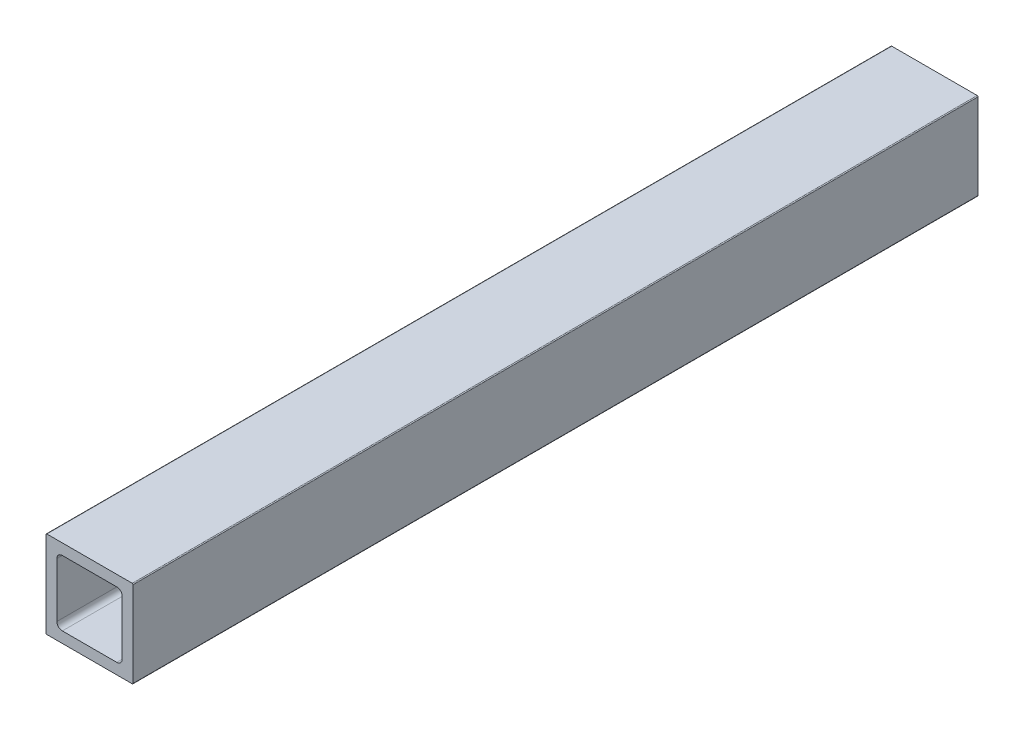
ISO-10303-21;
HEADER;
FILE_DESCRIPTION(('STEP AP214'),'2;1');
FILE_NAME('part.step','',(''),(''),'','','');
FILE_SCHEMA(('AUTOMOTIVE_DESIGN { 1 0 10303 214 1 1 1 1 }'));
ENDSEC;
DATA;
#1=APPLICATION_CONTEXT('core data for automotive mechanical design processes');
#2=APPLICATION_PROTOCOL_DEFINITION('international standard','automotive_design',2000,#1);
#3=PRODUCT_CONTEXT('',#1,'mechanical');
#4=PRODUCT('Part','Part','',(#3));
#5=PRODUCT_RELATED_PRODUCT_CATEGORY('part','',(#4));
#6=PRODUCT_DEFINITION_FORMATION('','',#4);
#7=PRODUCT_DEFINITION_CONTEXT('part definition',#1,'design');
#8=PRODUCT_DEFINITION('design','',#6,#7);
#9=PRODUCT_DEFINITION_SHAPE('','',#8);
#10=(LENGTH_UNIT() NAMED_UNIT(*) SI_UNIT(.MILLI.,.METRE.));
#11=(NAMED_UNIT(*) PLANE_ANGLE_UNIT() SI_UNIT($,.RADIAN.));
#12=(NAMED_UNIT(*) SI_UNIT($,.STERADIAN.) SOLID_ANGLE_UNIT());
#13=UNCERTAINTY_MEASURE_WITH_UNIT(LENGTH_MEASURE(1.E-05),#10,'distance_accuracy_value','');
#14=(GEOMETRIC_REPRESENTATION_CONTEXT(3) GLOBAL_UNCERTAINTY_ASSIGNED_CONTEXT((#13)) GLOBAL_UNIT_ASSIGNED_CONTEXT((#10,
#11,#12)) REPRESENTATION_CONTEXT('',''));
#15=CARTESIAN_POINT('',(0.,0.,0.));
#16=DIRECTION('',(0.,0.,1.));
#17=DIRECTION('',(1.,0.,0.));
#18=AXIS2_PLACEMENT_3D('',#15,#16,#17);
#19=CARTESIAN_POINT('',(0.254,0.254,0.));
#20=DIRECTION('',(0.,0.,-1.));
#21=DIRECTION('',(0.,-1.,0.));
#22=AXIS2_PLACEMENT_3D('',#19,#20,#21);
#23=PLANE('',#22);
#24=CARTESIAN_POINT('',(0.254,0.254,0.));
#25=DIRECTION('',(0.,0.,1.));
#26=DIRECTION('',(-1.,0.,0.));
#27=AXIS2_PLACEMENT_3D('',#24,#25,#26);
#28=CIRCLE('',#27,0.254);
#29=CARTESIAN_POINT('',(0.,0.254,0.));
#30=VERTEX_POINT('',#29);
#31=CARTESIAN_POINT('',(0.254,0.,0.));
#32=VERTEX_POINT('',#31);
#33=EDGE_CURVE('E193',#30,#32,#28,.T.);
#34=ORIENTED_EDGE('',*,*,#33,.F.);
#35=DIRECTION('',(0.,-1.,0.));
#36=VECTOR('',#35,1.);
#37=CARTESIAN_POINT('',(0.,0.254,0.));
#38=LINE('',#37,#36);
#39=CARTESIAN_POINT('',(0.,25.146,0.));
#40=VERTEX_POINT('',#39);
#41=EDGE_CURVE('E191',#40,#30,#38,.T.);
#42=ORIENTED_EDGE('',*,*,#41,.F.);
#43=CARTESIAN_POINT('',(0.254,25.146,0.));
#44=DIRECTION('',(0.,0.,1.));
#45=DIRECTION('',(-1.,0.,0.));
#46=AXIS2_PLACEMENT_3D('',#43,#44,#45);
#47=CIRCLE('',#46,0.254);
#48=CARTESIAN_POINT('',(0.254,25.4,0.));
#49=VERTEX_POINT('',#48);
#50=EDGE_CURVE('E213',#49,#40,#47,.T.);
#51=ORIENTED_EDGE('',*,*,#50,.F.);
#52=DIRECTION('',(-1.,0.,0.));
#53=VECTOR('',#52,1.);
#54=CARTESIAN_POINT('',(0.254,25.4,0.));
#55=LINE('',#54,#53);
#56=CARTESIAN_POINT('',(25.146,25.4,0.));
#57=VERTEX_POINT('',#56);
#58=EDGE_CURVE('E204',#57,#49,#55,.T.);
#59=ORIENTED_EDGE('',*,*,#58,.F.);
#60=CARTESIAN_POINT('',(25.146,25.146,0.));
#61=DIRECTION('',(0.,0.,1.));
#62=DIRECTION('',(-1.,0.,0.));
#63=AXIS2_PLACEMENT_3D('',#60,#61,#62);
#64=CIRCLE('',#63,0.254);
#65=CARTESIAN_POINT('',(25.4,25.146,0.));
#66=VERTEX_POINT('',#65);
#67=EDGE_CURVE('E236',#66,#57,#64,.T.);
#68=ORIENTED_EDGE('',*,*,#67,.F.);
#69=DIRECTION('',(0.,1.,0.));
#70=VECTOR('',#69,1.);
#71=CARTESIAN_POINT('',(25.4,0.254,0.));
#72=LINE('',#71,#70);
#73=CARTESIAN_POINT('',(25.4,0.254,0.));
#74=VERTEX_POINT('',#73);
#75=EDGE_CURVE('E235',#74,#66,#72,.T.);
#76=ORIENTED_EDGE('',*,*,#75,.F.);
#77=CARTESIAN_POINT('',(25.146,0.254,0.));
#78=DIRECTION('',(0.,0.,1.));
#79=DIRECTION('',(1.,0.,0.));
#80=AXIS2_PLACEMENT_3D('',#77,#78,#79);
#81=CIRCLE('',#80,0.254);
#82=CARTESIAN_POINT('',(25.146,0.,0.));
#83=VERTEX_POINT('',#82);
#84=EDGE_CURVE('E206',#83,#74,#81,.T.);
#85=ORIENTED_EDGE('',*,*,#84,.F.);
#86=DIRECTION('',(1.,0.,0.));
#87=VECTOR('',#86,1.);
#88=CARTESIAN_POINT('',(0.254,0.,0.));
#89=LINE('',#88,#87);
#90=EDGE_CURVE('E194',#32,#83,#89,.T.);
#91=ORIENTED_EDGE('',*,*,#90,.F.);
#92=EDGE_LOOP('',(#34,#42,#51,#59,#68,#76,#85,#91));
#93=FACE_BOUND('',#92,.T.);
#94=DIRECTION('',(0.,-1.,0.));
#95=VECTOR('',#94,1.);
#96=CARTESIAN_POINT('',(3.175,4.7625,0.));
#97=LINE('',#96,#95);
#98=CARTESIAN_POINT('',(3.175,20.6375,0.));
#99=VERTEX_POINT('',#98);
#100=CARTESIAN_POINT('',(3.175,4.7625,0.));
#101=VERTEX_POINT('',#100);
#102=EDGE_CURVE('E52',#99,#101,#97,.T.);
#103=ORIENTED_EDGE('',*,*,#102,.T.);
#104=CARTESIAN_POINT('',(4.7625,4.7625,0.));
#105=DIRECTION('',(0.,0.,1.));
#106=DIRECTION('',(1.,0.,0.));
#107=AXIS2_PLACEMENT_3D('',#104,#105,#106);
#108=CIRCLE('',#107,1.5875);
#109=CARTESIAN_POINT('',(4.7625,3.175,0.));
#110=VERTEX_POINT('',#109);
#111=EDGE_CURVE('E266',#101,#110,#108,.T.);
#112=ORIENTED_EDGE('',*,*,#111,.T.);
#113=DIRECTION('',(1.,0.,0.));
#114=VECTOR('',#113,1.);
#115=CARTESIAN_POINT('',(4.7625,3.175,0.));
#116=LINE('',#115,#114);
#117=CARTESIAN_POINT('',(20.6375,3.175,0.));
#118=VERTEX_POINT('',#117);
#119=EDGE_CURVE('E250',#110,#118,#116,.T.);
#120=ORIENTED_EDGE('',*,*,#119,.T.);
#121=CARTESIAN_POINT('',(20.6375,4.7625,0.));
#122=DIRECTION('',(0.,0.,1.));
#123=DIRECTION('',(-1.,0.,0.));
#124=AXIS2_PLACEMENT_3D('',#121,#122,#123);
#125=CIRCLE('',#124,1.5875);
#126=CARTESIAN_POINT('',(22.225,4.7625,0.));
#127=VERTEX_POINT('',#126);
#128=EDGE_CURVE('E223',#118,#127,#125,.T.);
#129=ORIENTED_EDGE('',*,*,#128,.T.);
#130=DIRECTION('',(0.,1.,0.));
#131=VECTOR('',#130,1.);
#132=CARTESIAN_POINT('',(22.225,4.7625,0.));
#133=LINE('',#132,#131);
#134=CARTESIAN_POINT('',(22.225,20.6375,0.));
#135=VERTEX_POINT('',#134);
#136=EDGE_CURVE('E219',#127,#135,#133,.T.);
#137=ORIENTED_EDGE('',*,*,#136,.T.);
#138=CARTESIAN_POINT('',(20.6375,20.6375,0.));
#139=DIRECTION('',(0.,0.,1.));
#140=DIRECTION('',(-1.,0.,0.));
#141=AXIS2_PLACEMENT_3D('',#138,#139,#140);
#142=CIRCLE('',#141,1.5875);
#143=CARTESIAN_POINT('',(20.6375,22.225,0.));
#144=VERTEX_POINT('',#143);
#145=EDGE_CURVE('E224',#135,#144,#142,.T.);
#146=ORIENTED_EDGE('',*,*,#145,.T.);
#147=DIRECTION('',(-1.,0.,0.));
#148=VECTOR('',#147,1.);
#149=CARTESIAN_POINT('',(4.7625,22.225,0.));
#150=LINE('',#149,#148);
#151=CARTESIAN_POINT('',(4.7625,22.225,0.));
#152=VERTEX_POINT('',#151);
#153=EDGE_CURVE('E229',#144,#152,#150,.T.);
#154=ORIENTED_EDGE('',*,*,#153,.T.);
#155=CARTESIAN_POINT('',(4.7625,20.6375,0.));
#156=DIRECTION('',(0.,0.,1.));
#157=DIRECTION('',(-1.,0.,0.));
#158=AXIS2_PLACEMENT_3D('',#155,#156,#157);
#159=CIRCLE('',#158,1.5875);
#160=EDGE_CURVE('E197',#152,#99,#159,.T.);
#161=ORIENTED_EDGE('',*,*,#160,.T.);
#162=EDGE_LOOP('',(#103,#112,#120,#129,#137,#146,#154,#161));
#163=FACE_BOUND('',#162,.T.);
#164=ADVANCED_FACE('F44',(#93,#163),#23,.T.);
#165=CARTESIAN_POINT('',(0.254,0.254,1828.8));
#166=DIRECTION('',(0.,0.,-1.));
#167=DIRECTION('',(-1.,0.,0.));
#168=AXIS2_PLACEMENT_3D('',#165,#166,#167);
#169=CYLINDRICAL_SURFACE('',#168,0.254);
#170=CARTESIAN_POINT('',(0.254,0.254,246.38));
#171=DIRECTION('',(0.,0.,-1.));
#172=DIRECTION('',(-1.,0.,0.));
#173=AXIS2_PLACEMENT_3D('',#170,#171,#172);
#174=CIRCLE('',#173,0.254);
#175=CARTESIAN_POINT('',(0.,0.254,246.38));
#176=VERTEX_POINT('',#175);
#177=CARTESIAN_POINT('',(0.254,0.,246.38));
#178=VERTEX_POINT('',#177);
#179=EDGE_CURVE('E172',#176,#178,#174,.F.);
#180=ORIENTED_EDGE('',*,*,#179,.F.);
#181=DIRECTION('',(0.,0.,-1.));
#182=VECTOR('',#181,1.);
#183=CARTESIAN_POINT('',(0.,0.254,1828.8));
#184=LINE('',#183,#182);
#185=EDGE_CURVE('E183',#176,#30,#184,.T.);
#186=ORIENTED_EDGE('',*,*,#185,.T.);
#187=ORIENTED_EDGE('',*,*,#33,.T.);
#188=DIRECTION('',(0.,0.,-1.));
#189=VECTOR('',#188,1.);
#190=CARTESIAN_POINT('',(0.254,0.,1828.8));
#191=LINE('',#190,#189);
#192=EDGE_CURVE('E185',#178,#32,#191,.T.);
#193=ORIENTED_EDGE('',*,*,#192,.F.);
#194=EDGE_LOOP('',(#180,#186,#187,#193));
#195=FACE_BOUND('',#194,.T.);
#196=ADVANCED_FACE('F181',(#195),#169,.T.);
#197=CARTESIAN_POINT('',(0.254,0.,1828.8));
#198=DIRECTION('',(0.,1.,0.));
#199=DIRECTION('',(1.,0.,0.));
#200=AXIS2_PLACEMENT_3D('',#197,#198,#199);
#201=PLANE('',#200);
#202=DIRECTION('',(0.,0.,-1.));
#203=VECTOR('',#202,1.);
#204=CARTESIAN_POINT('',(25.146,0.,1828.8));
#205=LINE('',#204,#203);
#206=CARTESIAN_POINT('',(25.146,0.,246.38));
#207=VERTEX_POINT('',#206);
#208=EDGE_CURVE('E210',#207,#83,#205,.T.);
#209=ORIENTED_EDGE('',*,*,#208,.F.);
#210=DIRECTION('',(1.,0.,0.));
#211=VECTOR('',#210,1.);
#212=CARTESIAN_POINT('',(0.,0.,246.38));
#213=LINE('',#212,#211);
#214=EDGE_CURVE('E177',#178,#207,#213,.T.);
#215=ORIENTED_EDGE('',*,*,#214,.F.);
#216=ORIENTED_EDGE('',*,*,#192,.T.);
#217=ORIENTED_EDGE('',*,*,#90,.T.);
#218=EDGE_LOOP('',(#209,#215,#216,#217));
#219=FACE_BOUND('',#218,.T.);
#220=ADVANCED_FACE('F289',(#219),#201,.F.);
#221=CARTESIAN_POINT('',(25.146,0.254,1828.8));
#222=DIRECTION('',(0.,0.,-1.));
#223=DIRECTION('',(-1.,0.,0.));
#224=AXIS2_PLACEMENT_3D('',#221,#222,#223);
#225=CYLINDRICAL_SURFACE('',#224,0.254);
#226=CARTESIAN_POINT('',(25.146,0.254,246.38));
#227=DIRECTION('',(0.,0.,-1.));
#228=DIRECTION('',(-1.,0.,0.));
#229=AXIS2_PLACEMENT_3D('',#226,#227,#228);
#230=CIRCLE('',#229,0.254);
#231=CARTESIAN_POINT('',(25.4,0.254,246.38));
#232=VERTEX_POINT('',#231);
#233=EDGE_CURVE('E187',#207,#232,#230,.F.);
#234=ORIENTED_EDGE('',*,*,#233,.F.);
#235=ORIENTED_EDGE('',*,*,#208,.T.);
#236=ORIENTED_EDGE('',*,*,#84,.T.);
#237=DIRECTION('',(0.,0.,-1.));
#238=VECTOR('',#237,1.);
#239=CARTESIAN_POINT('',(25.4,0.254,1828.8));
#240=LINE('',#239,#238);
#241=EDGE_CURVE('E233',#232,#74,#240,.T.);
#242=ORIENTED_EDGE('',*,*,#241,.F.);
#243=EDGE_LOOP('',(#234,#235,#236,#242));
#244=FACE_BOUND('',#243,.T.);
#245=ADVANCED_FACE('F283',(#244),#225,.T.);
#246=CARTESIAN_POINT('',(25.4,0.254,1828.8));
#247=DIRECTION('',(-1.,0.,0.));
#248=DIRECTION('',(0.,0.,1.));
#249=AXIS2_PLACEMENT_3D('',#246,#247,#248);
#250=PLANE('',#249);
#251=DIRECTION('',(0.,0.,-1.));
#252=VECTOR('',#251,1.);
#253=CARTESIAN_POINT('',(25.4,25.146,1828.8));
#254=LINE('',#253,#252);
#255=CARTESIAN_POINT('',(25.4,25.146,246.38));
#256=VERTEX_POINT('',#255);
#257=EDGE_CURVE('E258',#256,#66,#254,.T.);
#258=ORIENTED_EDGE('',*,*,#257,.F.);
#259=DIRECTION('',(0.,1.,0.));
#260=VECTOR('',#259,1.);
#261=CARTESIAN_POINT('',(25.4,0.,246.38));
#262=LINE('',#261,#260);
#263=EDGE_CURVE('E498',#232,#256,#262,.T.);
#264=ORIENTED_EDGE('',*,*,#263,.F.);
#265=ORIENTED_EDGE('',*,*,#241,.T.);
#266=ORIENTED_EDGE('',*,*,#75,.T.);
#267=EDGE_LOOP('',(#258,#264,#265,#266));
#268=FACE_BOUND('',#267,.T.);
#269=ADVANCED_FACE('F288',(#268),#250,.F.);
#270=CARTESIAN_POINT('',(25.146,25.146,1828.8));
#271=DIRECTION('',(0.,0.,-1.));
#272=DIRECTION('',(-1.,0.,0.));
#273=AXIS2_PLACEMENT_3D('',#270,#271,#272);
#274=CYLINDRICAL_SURFACE('',#273,0.254);
#275=CARTESIAN_POINT('',(25.146,25.146,246.38));
#276=DIRECTION('',(0.,0.,-1.));
#277=DIRECTION('',(-1.,0.,0.));
#278=AXIS2_PLACEMENT_3D('',#275,#276,#277);
#279=CIRCLE('',#278,0.254);
#280=CARTESIAN_POINT('',(25.146,25.4,246.38));
#281=VERTEX_POINT('',#280);
#282=EDGE_CURVE('E492',#256,#281,#279,.F.);
#283=ORIENTED_EDGE('',*,*,#282,.F.);
#284=ORIENTED_EDGE('',*,*,#257,.T.);
#285=ORIENTED_EDGE('',*,*,#67,.T.);
#286=DIRECTION('',(0.,0.,-1.));
#287=VECTOR('',#286,1.);
#288=CARTESIAN_POINT('',(25.146,25.4,1828.8));
#289=LINE('',#288,#287);
#290=EDGE_CURVE('E227',#281,#57,#289,.T.);
#291=ORIENTED_EDGE('',*,*,#290,.F.);
#292=EDGE_LOOP('',(#283,#284,#285,#291));
#293=FACE_BOUND('',#292,.T.);
#294=ADVANCED_FACE('F46',(#293),#274,.T.);
#295=CARTESIAN_POINT('',(0.254,25.4,1828.8));
#296=DIRECTION('',(0.,-1.,0.));
#297=DIRECTION('',(0.,0.,-1.));
#298=AXIS2_PLACEMENT_3D('',#295,#296,#297);
#299=PLANE('',#298);
#300=DIRECTION('',(0.,0.,-1.));
#301=VECTOR('',#300,1.);
#302=CARTESIAN_POINT('',(0.254,25.4,1828.8));
#303=LINE('',#302,#301);
#304=CARTESIAN_POINT('',(0.254,25.4,246.38));
#305=VERTEX_POINT('',#304);
#306=EDGE_CURVE('E211',#305,#49,#303,.T.);
#307=ORIENTED_EDGE('',*,*,#306,.F.);
#308=DIRECTION('',(-1.,0.,0.));
#309=VECTOR('',#308,1.);
#310=CARTESIAN_POINT('',(0.,25.4,246.38));
#311=LINE('',#310,#309);
#312=EDGE_CURVE('E545',#281,#305,#311,.T.);
#313=ORIENTED_EDGE('',*,*,#312,.F.);
#314=ORIENTED_EDGE('',*,*,#290,.T.);
#315=ORIENTED_EDGE('',*,*,#58,.T.);
#316=EDGE_LOOP('',(#307,#313,#314,#315));
#317=FACE_BOUND('',#316,.T.);
#318=ADVANCED_FACE('F347',(#317),#299,.F.);
#319=CARTESIAN_POINT('',(0.254,25.146,1828.8));
#320=DIRECTION('',(0.,0.,-1.));
#321=DIRECTION('',(-1.,0.,0.));
#322=AXIS2_PLACEMENT_3D('',#319,#320,#321);
#323=CYLINDRICAL_SURFACE('',#322,0.254);
#324=CARTESIAN_POINT('',(0.254,25.146,246.38));
#325=DIRECTION('',(0.,0.,-1.));
#326=DIRECTION('',(-1.,0.,0.));
#327=AXIS2_PLACEMENT_3D('',#324,#325,#326);
#328=CIRCLE('',#327,0.254);
#329=CARTESIAN_POINT('',(0.,25.146,246.38));
#330=VERTEX_POINT('',#329);
#331=EDGE_CURVE('E59',#305,#330,#328,.F.);
#332=ORIENTED_EDGE('',*,*,#331,.F.);
#333=ORIENTED_EDGE('',*,*,#306,.T.);
#334=ORIENTED_EDGE('',*,*,#50,.T.);
#335=DIRECTION('',(0.,0.,-1.));
#336=VECTOR('',#335,1.);
#337=CARTESIAN_POINT('',(0.,25.146,1828.8));
#338=LINE('',#337,#336);
#339=EDGE_CURVE('E216',#330,#40,#338,.T.);
#340=ORIENTED_EDGE('',*,*,#339,.F.);
#341=EDGE_LOOP('',(#332,#333,#334,#340));
#342=FACE_BOUND('',#341,.T.);
#343=ADVANCED_FACE('F276',(#342),#323,.T.);
#344=CARTESIAN_POINT('',(0.,0.254,1828.8));
#345=DIRECTION('',(1.,0.,0.));
#346=DIRECTION('',(0.,1.,0.));
#347=AXIS2_PLACEMENT_3D('',#344,#345,#346);
#348=PLANE('',#347);
#349=ORIENTED_EDGE('',*,*,#185,.F.);
#350=DIRECTION('',(0.,-1.,0.));
#351=VECTOR('',#350,1.);
#352=CARTESIAN_POINT('',(0.,0.,246.38));
#353=LINE('',#352,#351);
#354=EDGE_CURVE('E169',#330,#176,#353,.T.);
#355=ORIENTED_EDGE('',*,*,#354,.F.);
#356=ORIENTED_EDGE('',*,*,#339,.T.);
#357=ORIENTED_EDGE('',*,*,#41,.T.);
#358=EDGE_LOOP('',(#349,#355,#356,#357));
#359=FACE_BOUND('',#358,.T.);
#360=ADVANCED_FACE('F189',(#359),#348,.F.);
#361=CARTESIAN_POINT('',(4.7625,4.7625,1828.8));
#362=DIRECTION('',(0.,0.,-1.));
#363=DIRECTION('',(-1.,0.,0.));
#364=AXIS2_PLACEMENT_3D('',#361,#362,#363);
#365=CYLINDRICAL_SURFACE('',#364,1.5875);
#366=DIRECTION('',(0.,0.,-1.));
#367=VECTOR('',#366,1.);
#368=CARTESIAN_POINT('',(3.175,4.7625,1828.8));
#369=LINE('',#368,#367);
#370=CARTESIAN_POINT('',(3.175,4.7625,246.38));
#371=VERTEX_POINT('',#370);
#372=EDGE_CURVE('E186',#371,#101,#369,.T.);
#373=ORIENTED_EDGE('',*,*,#372,.F.);
#374=CARTESIAN_POINT('',(4.7625,4.7625,246.38));
#375=DIRECTION('',(0.,0.,-1.));
#376=DIRECTION('',(-1.,0.,0.));
#377=AXIS2_PLACEMENT_3D('',#374,#375,#376);
#378=CIRCLE('',#377,1.5875);
#379=CARTESIAN_POINT('',(4.7625,3.175,246.38));
#380=VERTEX_POINT('',#379);
#381=EDGE_CURVE('E66',#371,#380,#378,.F.);
#382=ORIENTED_EDGE('',*,*,#381,.T.);
#383=DIRECTION('',(0.,0.,-1.));
#384=VECTOR('',#383,1.);
#385=CARTESIAN_POINT('',(4.7625,3.175,1828.8));
#386=LINE('',#385,#384);
#387=EDGE_CURVE('E214',#380,#110,#386,.T.);
#388=ORIENTED_EDGE('',*,*,#387,.T.);
#389=ORIENTED_EDGE('',*,*,#111,.F.);
#390=EDGE_LOOP('',(#373,#382,#388,#389));
#391=FACE_BOUND('',#390,.T.);
#392=ADVANCED_FACE('F275',(#391),#365,.F.);
#393=CARTESIAN_POINT('',(4.7625,3.175,1828.8));
#394=DIRECTION('',(0.,1.,0.));
#395=DIRECTION('',(1.,0.,0.));
#396=AXIS2_PLACEMENT_3D('',#393,#394,#395);
#397=PLANE('',#396);
#398=DIRECTION('',(-1.,0.,0.));
#399=VECTOR('',#398,1.);
#400=CARTESIAN_POINT('',(4.7625,3.175,246.38));
#401=LINE('',#400,#399);
#402=CARTESIAN_POINT('',(20.6375,3.175,246.38));
#403=VERTEX_POINT('',#402);
#404=EDGE_CURVE('E532',#403,#380,#401,.T.);
#405=ORIENTED_EDGE('',*,*,#404,.F.);
#406=DIRECTION('',(0.,0.,-1.));
#407=VECTOR('',#406,1.);
#408=CARTESIAN_POINT('',(20.6375,3.175,1828.8));
#409=LINE('',#408,#407);
#410=EDGE_CURVE('E217',#403,#118,#409,.T.);
#411=ORIENTED_EDGE('',*,*,#410,.T.);
#412=ORIENTED_EDGE('',*,*,#119,.F.);
#413=ORIENTED_EDGE('',*,*,#387,.F.);
#414=EDGE_LOOP('',(#405,#411,#412,#413));
#415=FACE_BOUND('',#414,.T.);
#416=ADVANCED_FACE('F302',(#415),#397,.T.);
#417=CARTESIAN_POINT('',(20.6375,4.7625,1828.8));
#418=DIRECTION('',(0.,0.,-1.));
#419=DIRECTION('',(-1.,0.,0.));
#420=AXIS2_PLACEMENT_3D('',#417,#418,#419);
#421=CYLINDRICAL_SURFACE('',#420,1.5875);
#422=ORIENTED_EDGE('',*,*,#410,.F.);
#423=CARTESIAN_POINT('',(20.6375,4.7625,246.38));
#424=DIRECTION('',(0.,0.,-1.));
#425=DIRECTION('',(-1.,0.,0.));
#426=AXIS2_PLACEMENT_3D('',#423,#424,#425);
#427=CIRCLE('',#426,1.5875);
#428=CARTESIAN_POINT('',(22.225,4.7625,246.38));
#429=VERTEX_POINT('',#428);
#430=EDGE_CURVE('E513',#403,#429,#427,.F.);
#431=ORIENTED_EDGE('',*,*,#430,.T.);
#432=DIRECTION('',(0.,0.,-1.));
#433=VECTOR('',#432,1.);
#434=CARTESIAN_POINT('',(22.225,4.7625,1828.8));
#435=LINE('',#434,#433);
#436=EDGE_CURVE('E254',#429,#127,#435,.T.);
#437=ORIENTED_EDGE('',*,*,#436,.T.);
#438=ORIENTED_EDGE('',*,*,#128,.F.);
#439=EDGE_LOOP('',(#422,#431,#437,#438));
#440=FACE_BOUND('',#439,.T.);
#441=ADVANCED_FACE('F297',(#440),#421,.F.);
#442=CARTESIAN_POINT('',(22.225,4.7625,1828.8));
#443=DIRECTION('',(-1.,0.,0.));
#444=DIRECTION('',(0.,0.,1.));
#445=AXIS2_PLACEMENT_3D('',#442,#443,#444);
#446=PLANE('',#445);
#447=DIRECTION('',(0.,-1.,0.));
#448=VECTOR('',#447,1.);
#449=CARTESIAN_POINT('',(22.225,4.7625,246.38));
#450=LINE('',#449,#448);
#451=CARTESIAN_POINT('',(22.225,20.6375,246.38));
#452=VERTEX_POINT('',#451);
#453=EDGE_CURVE('E535',#452,#429,#450,.T.);
#454=ORIENTED_EDGE('',*,*,#453,.F.);
#455=DIRECTION('',(0.,0.,-1.));
#456=VECTOR('',#455,1.);
#457=CARTESIAN_POINT('',(22.225,20.6375,1828.8));
#458=LINE('',#457,#456);
#459=EDGE_CURVE('E240',#452,#135,#458,.T.);
#460=ORIENTED_EDGE('',*,*,#459,.T.);
#461=ORIENTED_EDGE('',*,*,#136,.F.);
#462=ORIENTED_EDGE('',*,*,#436,.F.);
#463=EDGE_LOOP('',(#454,#460,#461,#462));
#464=FACE_BOUND('',#463,.T.);
#465=ADVANCED_FACE('F301',(#464),#446,.T.);
#466=CARTESIAN_POINT('',(20.6375,20.6375,1828.8));
#467=DIRECTION('',(0.,0.,-1.));
#468=DIRECTION('',(-1.,0.,0.));
#469=AXIS2_PLACEMENT_3D('',#466,#467,#468);
#470=CYLINDRICAL_SURFACE('',#469,1.5875);
#471=ORIENTED_EDGE('',*,*,#459,.F.);
#472=CARTESIAN_POINT('',(20.6375,20.6375,246.38));
#473=DIRECTION('',(0.,0.,-1.));
#474=DIRECTION('',(-1.,0.,0.));
#475=AXIS2_PLACEMENT_3D('',#472,#473,#474);
#476=CIRCLE('',#475,1.5875);
#477=CARTESIAN_POINT('',(20.6375,22.225,246.38));
#478=VERTEX_POINT('',#477);
#479=EDGE_CURVE('E537',#452,#478,#476,.F.);
#480=ORIENTED_EDGE('',*,*,#479,.T.);
#481=DIRECTION('',(0.,0.,-1.));
#482=VECTOR('',#481,1.);
#483=CARTESIAN_POINT('',(20.6375,22.225,1828.8));
#484=LINE('',#483,#482);
#485=EDGE_CURVE('E238',#478,#144,#484,.T.);
#486=ORIENTED_EDGE('',*,*,#485,.T.);
#487=ORIENTED_EDGE('',*,*,#145,.F.);
#488=EDGE_LOOP('',(#471,#480,#486,#487));
#489=FACE_BOUND('',#488,.T.);
#490=ADVANCED_FACE('F309',(#489),#470,.F.);
#491=CARTESIAN_POINT('',(4.7625,22.225,1828.8));
#492=DIRECTION('',(0.,-1.,0.));
#493=DIRECTION('',(0.,0.,-1.));
#494=AXIS2_PLACEMENT_3D('',#491,#492,#493);
#495=PLANE('',#494);
#496=DIRECTION('',(1.,0.,0.));
#497=VECTOR('',#496,1.);
#498=CARTESIAN_POINT('',(4.7625,22.225,246.38));
#499=LINE('',#498,#497);
#500=CARTESIAN_POINT('',(4.7625,22.225,246.38));
#501=VERTEX_POINT('',#500);
#502=EDGE_CURVE('E540',#501,#478,#499,.T.);
#503=ORIENTED_EDGE('',*,*,#502,.F.);
#504=DIRECTION('',(0.,0.,-1.));
#505=VECTOR('',#504,1.);
#506=CARTESIAN_POINT('',(4.7625,22.225,1828.8));
#507=LINE('',#506,#505);
#508=EDGE_CURVE('E241',#501,#152,#507,.T.);
#509=ORIENTED_EDGE('',*,*,#508,.T.);
#510=ORIENTED_EDGE('',*,*,#153,.F.);
#511=ORIENTED_EDGE('',*,*,#485,.F.);
#512=EDGE_LOOP('',(#503,#509,#510,#511));
#513=FACE_BOUND('',#512,.T.);
#514=ADVANCED_FACE('F313',(#513),#495,.T.);
#515=CARTESIAN_POINT('',(4.7625,20.6375,1828.8));
#516=DIRECTION('',(0.,0.,-1.));
#517=DIRECTION('',(-1.,0.,0.));
#518=AXIS2_PLACEMENT_3D('',#515,#516,#517);
#519=CYLINDRICAL_SURFACE('',#518,1.5875);
#520=ORIENTED_EDGE('',*,*,#508,.F.);
#521=CARTESIAN_POINT('',(4.7625,20.6375,246.38));
#522=DIRECTION('',(0.,0.,-1.));
#523=DIRECTION('',(-1.,0.,0.));
#524=AXIS2_PLACEMENT_3D('',#521,#522,#523);
#525=CIRCLE('',#524,1.5875);
#526=CARTESIAN_POINT('',(3.175,20.6375,246.38));
#527=VERTEX_POINT('',#526);
#528=EDGE_CURVE('E542',#501,#527,#525,.F.);
#529=ORIENTED_EDGE('',*,*,#528,.T.);
#530=DIRECTION('',(0.,0.,-1.));
#531=VECTOR('',#530,1.);
#532=CARTESIAN_POINT('',(3.175,20.6375,1828.8));
#533=LINE('',#532,#531);
#534=EDGE_CURVE('E245',#527,#99,#533,.T.);
#535=ORIENTED_EDGE('',*,*,#534,.T.);
#536=ORIENTED_EDGE('',*,*,#160,.F.);
#537=EDGE_LOOP('',(#520,#529,#535,#536));
#538=FACE_BOUND('',#537,.T.);
#539=ADVANCED_FACE('F390',(#538),#519,.F.);
#540=CARTESIAN_POINT('',(3.175,4.7625,1828.8));
#541=DIRECTION('',(1.,0.,0.));
#542=DIRECTION('',(0.,1.,0.));
#543=AXIS2_PLACEMENT_3D('',#540,#541,#542);
#544=PLANE('',#543);
#545=DIRECTION('',(0.,1.,0.));
#546=VECTOR('',#545,1.);
#547=CARTESIAN_POINT('',(3.175,4.7625,246.38));
#548=LINE('',#547,#546);
#549=EDGE_CURVE('E11',#371,#527,#548,.T.);
#550=ORIENTED_EDGE('',*,*,#549,.F.);
#551=ORIENTED_EDGE('',*,*,#372,.T.);
#552=ORIENTED_EDGE('',*,*,#102,.F.);
#553=ORIENTED_EDGE('',*,*,#534,.F.);
#554=EDGE_LOOP('',(#550,#551,#552,#553));
#555=FACE_BOUND('',#554,.T.);
#556=ADVANCED_FACE('F394',(#555),#544,.T.);
#557=CARTESIAN_POINT('',(0.,0.,246.38));
#558=DIRECTION('',(0.,0.,-1.));
#559=DIRECTION('',(-1.,0.,0.));
#560=AXIS2_PLACEMENT_3D('',#557,#558,#559);
#561=PLANE('',#560);
#562=ORIENTED_EDGE('',*,*,#179,.T.);
#563=ORIENTED_EDGE('',*,*,#214,.T.);
#564=ORIENTED_EDGE('',*,*,#233,.T.);
#565=ORIENTED_EDGE('',*,*,#263,.T.);
#566=ORIENTED_EDGE('',*,*,#282,.T.);
#567=ORIENTED_EDGE('',*,*,#312,.T.);
#568=ORIENTED_EDGE('',*,*,#331,.T.);
#569=ORIENTED_EDGE('',*,*,#354,.T.);
#570=EDGE_LOOP('',(#562,#563,#564,#565,#566,#567,#568,#569));
#571=FACE_BOUND('',#570,.T.);
#572=ORIENTED_EDGE('',*,*,#549,.T.);
#573=ORIENTED_EDGE('',*,*,#528,.F.);
#574=ORIENTED_EDGE('',*,*,#502,.T.);
#575=ORIENTED_EDGE('',*,*,#479,.F.);
#576=ORIENTED_EDGE('',*,*,#453,.T.);
#577=ORIENTED_EDGE('',*,*,#430,.F.);
#578=ORIENTED_EDGE('',*,*,#404,.T.);
#579=ORIENTED_EDGE('',*,*,#381,.F.);
#580=EDGE_LOOP('',(#572,#573,#574,#575,#576,#577,#578,#579));
#581=FACE_BOUND('',#580,.T.);
#582=ADVANCED_FACE('F171',(#571,#581),#561,.F.);
#583=CLOSED_SHELL('',(#164,#196,#220,#245,#269,#294,#318,#343,#360,#392,#416,#441,#465,#490,
#514,#539,#556,#582));
#584=MANIFOLD_SOLID_BREP('B2',#583);
#585=ADVANCED_BREP_SHAPE_REPRESENTATION('',(#18,#584),#14);
#586=SHAPE_DEFINITION_REPRESENTATION(#9,#585);
ENDSEC;
END-ISO-10303-21;
